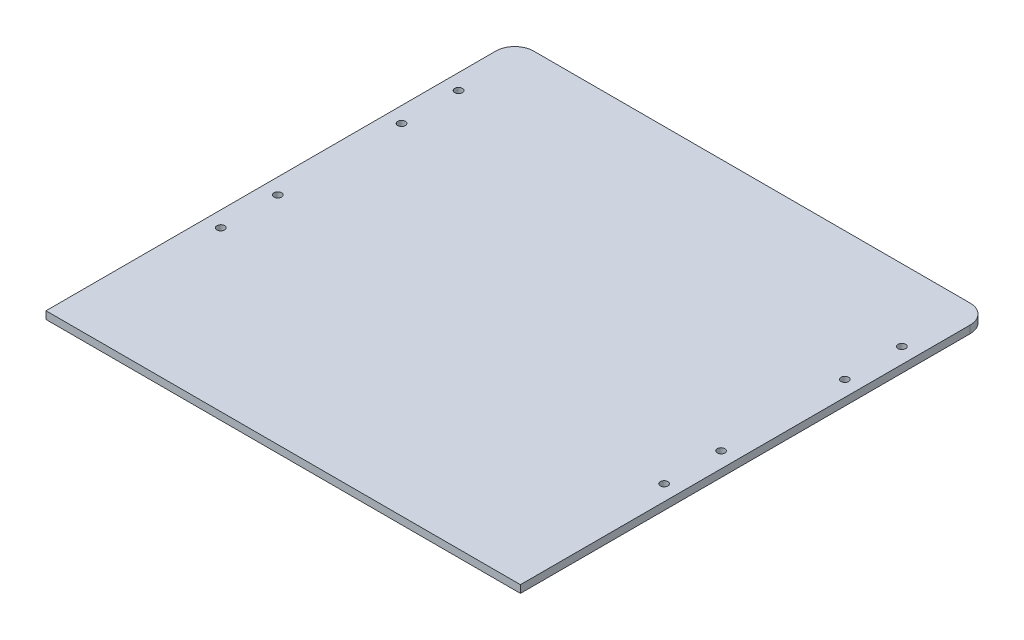
ISO-10303-21;
HEADER;
FILE_DESCRIPTION(('STEP AP214'),'2;1');
FILE_NAME('part.step','',(''),(''),'','','');
FILE_SCHEMA(('AUTOMOTIVE_DESIGN { 1 0 10303 214 1 1 1 1 }'));
ENDSEC;
DATA;
#1=APPLICATION_CONTEXT('core data for automotive mechanical design processes');
#2=APPLICATION_PROTOCOL_DEFINITION('international standard','automotive_design',2000,#1);
#3=PRODUCT_CONTEXT('',#1,'mechanical');
#4=PRODUCT('Part','Part','',(#3));
#5=PRODUCT_RELATED_PRODUCT_CATEGORY('part','',(#4));
#6=PRODUCT_DEFINITION_FORMATION('','',#4);
#7=PRODUCT_DEFINITION_CONTEXT('part definition',#1,'design');
#8=PRODUCT_DEFINITION('design','',#6,#7);
#9=PRODUCT_DEFINITION_SHAPE('','',#8);
#10=(LENGTH_UNIT() NAMED_UNIT(*) SI_UNIT(.MILLI.,.METRE.));
#11=(NAMED_UNIT(*) PLANE_ANGLE_UNIT() SI_UNIT($,.RADIAN.));
#12=(NAMED_UNIT(*) SI_UNIT($,.STERADIAN.) SOLID_ANGLE_UNIT());
#13=UNCERTAINTY_MEASURE_WITH_UNIT(LENGTH_MEASURE(1.E-05),#10,'distance_accuracy_value','');
#14=(GEOMETRIC_REPRESENTATION_CONTEXT(3) GLOBAL_UNCERTAINTY_ASSIGNED_CONTEXT((#13)) GLOBAL_UNIT_ASSIGNED_CONTEXT((#10,
#11,#12)) REPRESENTATION_CONTEXT('',''));
#15=CARTESIAN_POINT('',(0.,0.,0.));
#16=DIRECTION('',(0.,0.,1.));
#17=DIRECTION('',(1.,0.,0.));
#18=AXIS2_PLACEMENT_3D('',#15,#16,#17);
#19=CARTESIAN_POINT('',(-125.,2.,123.5));
#20=DIRECTION('',(1.,0.,0.));
#21=DIRECTION('',(0.,0.,-1.));
#22=AXIS2_PLACEMENT_3D('',#19,#20,#21);
#23=PLANE('',#22);
#24=DIRECTION('',(0.,0.,1.));
#25=VECTOR('',#24,1.);
#26=CARTESIAN_POINT('',(-125.,-2.,123.5));
#27=LINE('',#26,#25);
#28=CARTESIAN_POINT('',(-125.,-2.,-113.5));
#29=VERTEX_POINT('',#28);
#30=CARTESIAN_POINT('',(-125.,-2.,123.5));
#31=VERTEX_POINT('',#30);
#32=EDGE_CURVE('E129',#29,#31,#27,.T.);
#33=ORIENTED_EDGE('',*,*,#32,.T.);
#34=DIRECTION('',(0.,-1.,0.));
#35=VECTOR('',#34,1.);
#36=CARTESIAN_POINT('',(-125.,2.,123.5));
#37=LINE('',#36,#35);
#38=CARTESIAN_POINT('',(-125.,2.,123.5));
#39=VERTEX_POINT('',#38);
#40=EDGE_CURVE('E11',#39,#31,#37,.T.);
#41=ORIENTED_EDGE('',*,*,#40,.F.);
#42=DIRECTION('',(0.,0.,1.));
#43=VECTOR('',#42,1.);
#44=CARTESIAN_POINT('',(-125.,2.,123.5));
#45=LINE('',#44,#43);
#46=CARTESIAN_POINT('',(-125.,2.,-113.5));
#47=VERTEX_POINT('',#46);
#48=EDGE_CURVE('E139',#47,#39,#45,.T.);
#49=ORIENTED_EDGE('',*,*,#48,.F.);
#50=DIRECTION('',(0.,-1.,0.));
#51=VECTOR('',#50,1.);
#52=CARTESIAN_POINT('',(-125.,2.,-113.5));
#53=LINE('',#52,#51);
#54=EDGE_CURVE('E125',#47,#29,#53,.T.);
#55=ORIENTED_EDGE('',*,*,#54,.T.);
#56=EDGE_LOOP('',(#33,#41,#49,#55));
#57=FACE_BOUND('',#56,.T.);
#58=ADVANCED_FACE('F43',(#57),#23,.F.);
#59=CARTESIAN_POINT('',(-125.,2.,123.5));
#60=DIRECTION('',(0.,0.,-1.));
#61=DIRECTION('',(-1.,0.,0.));
#62=AXIS2_PLACEMENT_3D('',#59,#60,#61);
#63=PLANE('',#62);
#64=DIRECTION('',(1.,0.,0.));
#65=VECTOR('',#64,1.);
#66=CARTESIAN_POINT('',(-125.,-2.,123.5));
#67=LINE('',#66,#65);
#68=CARTESIAN_POINT('',(125.,-2.,123.5));
#69=VERTEX_POINT('',#68);
#70=EDGE_CURVE('E132',#31,#69,#67,.T.);
#71=ORIENTED_EDGE('',*,*,#70,.T.);
#72=DIRECTION('',(0.,-1.,0.));
#73=VECTOR('',#72,1.);
#74=CARTESIAN_POINT('',(125.,2.,123.5));
#75=LINE('',#74,#73);
#76=CARTESIAN_POINT('',(125.,2.,123.5));
#77=VERTEX_POINT('',#76);
#78=EDGE_CURVE('E52',#77,#69,#75,.T.);
#79=ORIENTED_EDGE('',*,*,#78,.F.);
#80=DIRECTION('',(1.,0.,0.));
#81=VECTOR('',#80,1.);
#82=CARTESIAN_POINT('',(-125.,2.,123.5));
#83=LINE('',#82,#81);
#84=EDGE_CURVE('E98',#39,#77,#83,.T.);
#85=ORIENTED_EDGE('',*,*,#84,.F.);
#86=ORIENTED_EDGE('',*,*,#40,.T.);
#87=EDGE_LOOP('',(#71,#79,#85,#86));
#88=FACE_BOUND('',#87,.T.);
#89=ADVANCED_FACE('F207',(#88),#63,.F.);
#90=CARTESIAN_POINT('',(125.,2.,123.5));
#91=DIRECTION('',(-1.,0.,0.));
#92=DIRECTION('',(0.,0.,1.));
#93=AXIS2_PLACEMENT_3D('',#90,#91,#92);
#94=PLANE('',#93);
#95=DIRECTION('',(0.,0.,-1.));
#96=VECTOR('',#95,1.);
#97=CARTESIAN_POINT('',(125.,-2.,123.5));
#98=LINE('',#97,#96);
#99=CARTESIAN_POINT('',(125.,-2.,-113.5));
#100=VERTEX_POINT('',#99);
#101=EDGE_CURVE('E134',#69,#100,#98,.T.);
#102=ORIENTED_EDGE('',*,*,#101,.T.);
#103=DIRECTION('',(0.,-1.,0.));
#104=VECTOR('',#103,1.);
#105=CARTESIAN_POINT('',(125.,2.,-113.5));
#106=LINE('',#105,#104);
#107=CARTESIAN_POINT('',(125.,2.,-113.5));
#108=VERTEX_POINT('',#107);
#109=EDGE_CURVE('E120',#108,#100,#106,.T.);
#110=ORIENTED_EDGE('',*,*,#109,.F.);
#111=DIRECTION('',(0.,0.,-1.));
#112=VECTOR('',#111,1.);
#113=CARTESIAN_POINT('',(125.,2.,123.5));
#114=LINE('',#113,#112);
#115=EDGE_CURVE('E111',#77,#108,#114,.T.);
#116=ORIENTED_EDGE('',*,*,#115,.F.);
#117=ORIENTED_EDGE('',*,*,#78,.T.);
#118=EDGE_LOOP('',(#102,#110,#116,#117));
#119=FACE_BOUND('',#118,.T.);
#120=ADVANCED_FACE('F211',(#119),#94,.F.);
#121=CARTESIAN_POINT('',(115.,2.,-113.5));
#122=DIRECTION('',(0.,-1.,0.));
#123=DIRECTION('',(0.,0.,-1.));
#124=AXIS2_PLACEMENT_3D('',#121,#122,#123);
#125=CYLINDRICAL_SURFACE('',#124,9.99999999999999);
#126=CARTESIAN_POINT('',(115.,-2.,-113.5));
#127=DIRECTION('',(0.,1.,0.));
#128=DIRECTION('',(0.,0.,-1.));
#129=AXIS2_PLACEMENT_3D('',#126,#127,#128);
#130=CIRCLE('',#129,9.99999999999999);
#131=CARTESIAN_POINT('',(115.,-2.,-123.5));
#132=VERTEX_POINT('',#131);
#133=EDGE_CURVE('E119',#100,#132,#130,.T.);
#134=ORIENTED_EDGE('',*,*,#133,.T.);
#135=DIRECTION('',(0.,-1.,0.));
#136=VECTOR('',#135,1.);
#137=CARTESIAN_POINT('',(115.,2.,-123.5));
#138=LINE('',#137,#136);
#139=CARTESIAN_POINT('',(115.,2.,-123.5));
#140=VERTEX_POINT('',#139);
#141=EDGE_CURVE('E116',#140,#132,#138,.T.);
#142=ORIENTED_EDGE('',*,*,#141,.F.);
#143=CARTESIAN_POINT('',(115.,2.,-113.5));
#144=DIRECTION('',(0.,1.,0.));
#145=DIRECTION('',(0.,0.,-1.));
#146=AXIS2_PLACEMENT_3D('',#143,#144,#145);
#147=CIRCLE('',#146,9.99999999999999);
#148=EDGE_CURVE('E105',#108,#140,#147,.T.);
#149=ORIENTED_EDGE('',*,*,#148,.F.);
#150=ORIENTED_EDGE('',*,*,#109,.T.);
#151=EDGE_LOOP('',(#134,#142,#149,#150));
#152=FACE_BOUND('',#151,.T.);
#153=ADVANCED_FACE('F117',(#152),#125,.T.);
#154=CARTESIAN_POINT('',(-115.,2.,-123.5));
#155=DIRECTION('',(0.,0.,1.));
#156=DIRECTION('',(1.,0.,0.));
#157=AXIS2_PLACEMENT_3D('',#154,#155,#156);
#158=PLANE('',#157);
#159=DIRECTION('',(-1.,0.,0.));
#160=VECTOR('',#159,1.);
#161=CARTESIAN_POINT('',(-115.,-2.,-123.5));
#162=LINE('',#161,#160);
#163=CARTESIAN_POINT('',(-115.,-2.,-123.5));
#164=VERTEX_POINT('',#163);
#165=EDGE_CURVE('E84',#132,#164,#162,.T.);
#166=ORIENTED_EDGE('',*,*,#165,.T.);
#167=DIRECTION('',(0.,-1.,0.));
#168=VECTOR('',#167,1.);
#169=CARTESIAN_POINT('',(-115.,2.,-123.5));
#170=LINE('',#169,#168);
#171=CARTESIAN_POINT('',(-115.,2.,-123.5));
#172=VERTEX_POINT('',#171);
#173=EDGE_CURVE('E121',#172,#164,#170,.T.);
#174=ORIENTED_EDGE('',*,*,#173,.F.);
#175=DIRECTION('',(-1.,0.,0.));
#176=VECTOR('',#175,1.);
#177=CARTESIAN_POINT('',(-115.,2.,-123.5));
#178=LINE('',#177,#176);
#179=EDGE_CURVE('E109',#140,#172,#178,.T.);
#180=ORIENTED_EDGE('',*,*,#179,.F.);
#181=ORIENTED_EDGE('',*,*,#141,.T.);
#182=EDGE_LOOP('',(#166,#174,#180,#181));
#183=FACE_BOUND('',#182,.T.);
#184=ADVANCED_FACE('F123',(#183),#158,.F.);
#185=CARTESIAN_POINT('',(-115.,2.,-113.5));
#186=DIRECTION('',(0.,-1.,0.));
#187=DIRECTION('',(0.,0.,-1.));
#188=AXIS2_PLACEMENT_3D('',#185,#186,#187);
#189=CYLINDRICAL_SURFACE('',#188,9.99999999999999);
#190=CARTESIAN_POINT('',(-115.,-2.,-113.5));
#191=DIRECTION('',(0.,1.,0.));
#192=DIRECTION('',(0.,0.,-1.));
#193=AXIS2_PLACEMENT_3D('',#190,#191,#192);
#194=CIRCLE('',#193,9.99999999999999);
#195=EDGE_CURVE('E90',#164,#29,#194,.T.);
#196=ORIENTED_EDGE('',*,*,#195,.T.);
#197=ORIENTED_EDGE('',*,*,#54,.F.);
#198=CARTESIAN_POINT('',(-115.,2.,-113.5));
#199=DIRECTION('',(0.,1.,0.));
#200=DIRECTION('',(0.,0.,-1.));
#201=AXIS2_PLACEMENT_3D('',#198,#199,#200);
#202=CIRCLE('',#201,9.99999999999999);
#203=EDGE_CURVE('E61',#172,#47,#202,.T.);
#204=ORIENTED_EDGE('',*,*,#203,.F.);
#205=ORIENTED_EDGE('',*,*,#173,.T.);
#206=EDGE_LOOP('',(#196,#197,#204,#205));
#207=FACE_BOUND('',#206,.T.);
#208=ADVANCED_FACE('F196',(#207),#189,.T.);
#209=CARTESIAN_POINT('',(-115.,2.,-113.5));
#210=DIRECTION('',(0.,-1.,0.));
#211=DIRECTION('',(0.,0.,-1.));
#212=AXIS2_PLACEMENT_3D('',#209,#210,#211);
#213=PLANE('',#212);
#214=CARTESIAN_POINT('',(-116.8,2.,-55.65));
#215=DIRECTION('',(0.,1.,0.));
#216=DIRECTION('',(0.,0.,1.));
#217=AXIS2_PLACEMENT_3D('',#214,#215,#216);
#218=CIRCLE('',#217,2.);
#219=CARTESIAN_POINT('',(-116.8,2.,-53.65));
#220=VERTEX_POINT('',#219);
#221=EDGE_CURVE('E329',#220,#220,#218,.T.);
#222=ORIENTED_EDGE('',*,*,#221,.F.);
#223=EDGE_LOOP('',(#222));
#224=FACE_BOUND('',#223,.T.);
#225=CARTESIAN_POINT('',(-116.8,2.,9.5541600217268));
#226=DIRECTION('',(0.,1.,0.));
#227=DIRECTION('',(0.,0.,1.));
#228=AXIS2_PLACEMENT_3D('',#225,#226,#227);
#229=CIRCLE('',#228,2.);
#230=CARTESIAN_POINT('',(-116.8,2.,11.5541600217268));
#231=VERTEX_POINT('',#230);
#232=EDGE_CURVE('E327',#231,#231,#229,.T.);
#233=ORIENTED_EDGE('',*,*,#232,.F.);
#234=EDGE_LOOP('',(#233));
#235=FACE_BOUND('',#234,.T.);
#236=CARTESIAN_POINT('',(-116.8,2.,39.6));
#237=DIRECTION('',(0.,1.,0.));
#238=DIRECTION('',(0.,0.,1.));
#239=AXIS2_PLACEMENT_3D('',#236,#237,#238);
#240=CIRCLE('',#239,2.);
#241=CARTESIAN_POINT('',(-116.8,2.,41.6));
#242=VERTEX_POINT('',#241);
#243=EDGE_CURVE('E330',#242,#242,#240,.T.);
#244=ORIENTED_EDGE('',*,*,#243,.F.);
#245=EDGE_LOOP('',(#244));
#246=FACE_BOUND('',#245,.T.);
#247=CARTESIAN_POINT('',(116.8,2.,39.6));
#248=DIRECTION('',(0.,1.,0.));
#249=DIRECTION('',(0.,0.,-1.));
#250=AXIS2_PLACEMENT_3D('',#247,#248,#249);
#251=CIRCLE('',#250,2.);
#252=CARTESIAN_POINT('',(116.8,2.,37.6));
#253=VERTEX_POINT('',#252);
#254=EDGE_CURVE('E335',#253,#253,#251,.T.);
#255=ORIENTED_EDGE('',*,*,#254,.F.);
#256=EDGE_LOOP('',(#255));
#257=FACE_BOUND('',#256,.T.);
#258=CARTESIAN_POINT('',(116.8,2.,9.55416002172677));
#259=DIRECTION('',(0.,1.,0.));
#260=DIRECTION('',(0.,0.,-1.));
#261=AXIS2_PLACEMENT_3D('',#258,#259,#260);
#262=CIRCLE('',#261,2.);
#263=CARTESIAN_POINT('',(116.8,2.,7.55416002172677));
#264=VERTEX_POINT('',#263);
#265=EDGE_CURVE('E341',#264,#264,#262,.T.);
#266=ORIENTED_EDGE('',*,*,#265,.F.);
#267=EDGE_LOOP('',(#266));
#268=FACE_BOUND('',#267,.T.);
#269=CARTESIAN_POINT('',(116.8,2.,-55.65));
#270=DIRECTION('',(0.,1.,0.));
#271=DIRECTION('',(0.,0.,-1.));
#272=AXIS2_PLACEMENT_3D('',#269,#270,#271);
#273=CIRCLE('',#272,2.);
#274=CARTESIAN_POINT('',(116.8,2.,-57.65));
#275=VERTEX_POINT('',#274);
#276=EDGE_CURVE('E351',#275,#275,#273,.T.);
#277=ORIENTED_EDGE('',*,*,#276,.F.);
#278=EDGE_LOOP('',(#277));
#279=FACE_BOUND('',#278,.T.);
#280=CARTESIAN_POINT('',(116.8,2.,-85.7));
#281=DIRECTION('',(0.,1.,0.));
#282=DIRECTION('',(0.,0.,-1.));
#283=AXIS2_PLACEMENT_3D('',#280,#281,#282);
#284=CIRCLE('',#283,2.);
#285=CARTESIAN_POINT('',(116.8,2.,-87.7));
#286=VERTEX_POINT('',#285);
#287=EDGE_CURVE('E356',#286,#286,#284,.T.);
#288=ORIENTED_EDGE('',*,*,#287,.F.);
#289=EDGE_LOOP('',(#288));
#290=FACE_BOUND('',#289,.T.);
#291=CARTESIAN_POINT('',(-116.8,2.,-85.7));
#292=DIRECTION('',(0.,1.,0.));
#293=DIRECTION('',(0.,0.,1.));
#294=AXIS2_PLACEMENT_3D('',#291,#292,#293);
#295=CIRCLE('',#294,2.);
#296=CARTESIAN_POINT('',(-116.8,2.,-83.7));
#297=VERTEX_POINT('',#296);
#298=EDGE_CURVE('E149',#297,#297,#295,.T.);
#299=ORIENTED_EDGE('',*,*,#298,.F.);
#300=EDGE_LOOP('',(#299));
#301=FACE_BOUND('',#300,.T.);
#302=ORIENTED_EDGE('',*,*,#48,.T.);
#303=ORIENTED_EDGE('',*,*,#84,.T.);
#304=ORIENTED_EDGE('',*,*,#115,.T.);
#305=ORIENTED_EDGE('',*,*,#148,.T.);
#306=ORIENTED_EDGE('',*,*,#179,.T.);
#307=ORIENTED_EDGE('',*,*,#203,.T.);
#308=EDGE_LOOP('',(#302,#303,#304,#305,#306,#307));
#309=FACE_BOUND('',#308,.T.);
#310=ADVANCED_FACE('F107',(#224,#235,#246,#257,#268,#279,#290,#301,#309),#213,.F.);
#311=CARTESIAN_POINT('',(-115.,-2.,-113.5));
#312=DIRECTION('',(0.,-1.,0.));
#313=DIRECTION('',(0.,0.,-1.));
#314=AXIS2_PLACEMENT_3D('',#311,#312,#313);
#315=PLANE('',#314);
#316=CARTESIAN_POINT('',(-116.8,-2.,-55.65));
#317=DIRECTION('',(0.,-1.,0.));
#318=DIRECTION('',(0.,0.,-1.));
#319=AXIS2_PLACEMENT_3D('',#316,#317,#318);
#320=CIRCLE('',#319,2.);
#321=CARTESIAN_POINT('',(-116.8,-2.,-57.65));
#322=VERTEX_POINT('',#321);
#323=EDGE_CURVE('E46',#322,#322,#320,.T.);
#324=ORIENTED_EDGE('',*,*,#323,.F.);
#325=EDGE_LOOP('',(#324));
#326=FACE_BOUND('',#325,.T.);
#327=CARTESIAN_POINT('',(-116.8,-2.,9.5541600217268));
#328=DIRECTION('',(0.,-1.,0.));
#329=DIRECTION('',(0.,0.,-1.));
#330=AXIS2_PLACEMENT_3D('',#327,#328,#329);
#331=CIRCLE('',#330,2.);
#332=CARTESIAN_POINT('',(-116.8,-2.,7.5541600217268));
#333=VERTEX_POINT('',#332);
#334=EDGE_CURVE('E163',#333,#333,#331,.T.);
#335=ORIENTED_EDGE('',*,*,#334,.F.);
#336=EDGE_LOOP('',(#335));
#337=FACE_BOUND('',#336,.T.);
#338=CARTESIAN_POINT('',(-116.8,-2.,39.6));
#339=DIRECTION('',(0.,-1.,0.));
#340=DIRECTION('',(0.,0.,-1.));
#341=AXIS2_PLACEMENT_3D('',#338,#339,#340);
#342=CIRCLE('',#341,2.);
#343=CARTESIAN_POINT('',(-116.8,-2.,37.6));
#344=VERTEX_POINT('',#343);
#345=EDGE_CURVE('E161',#344,#344,#342,.T.);
#346=ORIENTED_EDGE('',*,*,#345,.F.);
#347=EDGE_LOOP('',(#346));
#348=FACE_BOUND('',#347,.T.);
#349=CARTESIAN_POINT('',(116.8,-2.,39.6));
#350=DIRECTION('',(0.,-1.,0.));
#351=DIRECTION('',(0.,0.,-1.));
#352=AXIS2_PLACEMENT_3D('',#349,#350,#351);
#353=CIRCLE('',#352,2.);
#354=CARTESIAN_POINT('',(116.8,-2.,37.6));
#355=VERTEX_POINT('',#354);
#356=EDGE_CURVE('E158',#355,#355,#353,.T.);
#357=ORIENTED_EDGE('',*,*,#356,.F.);
#358=EDGE_LOOP('',(#357));
#359=FACE_BOUND('',#358,.T.);
#360=CARTESIAN_POINT('',(116.8,-2.,9.55416002172677));
#361=DIRECTION('',(0.,-1.,0.));
#362=DIRECTION('',(0.,0.,-1.));
#363=AXIS2_PLACEMENT_3D('',#360,#361,#362);
#364=CIRCLE('',#363,2.);
#365=CARTESIAN_POINT('',(116.8,-2.,7.55416002172677));
#366=VERTEX_POINT('',#365);
#367=EDGE_CURVE('E155',#366,#366,#364,.T.);
#368=ORIENTED_EDGE('',*,*,#367,.F.);
#369=EDGE_LOOP('',(#368));
#370=FACE_BOUND('',#369,.T.);
#371=CARTESIAN_POINT('',(116.8,-2.,-55.65));
#372=DIRECTION('',(0.,-1.,0.));
#373=DIRECTION('',(0.,0.,-1.));
#374=AXIS2_PLACEMENT_3D('',#371,#372,#373);
#375=CIRCLE('',#374,2.);
#376=CARTESIAN_POINT('',(116.8,-2.,-57.65));
#377=VERTEX_POINT('',#376);
#378=EDGE_CURVE('E152',#377,#377,#375,.T.);
#379=ORIENTED_EDGE('',*,*,#378,.F.);
#380=EDGE_LOOP('',(#379));
#381=FACE_BOUND('',#380,.T.);
#382=CARTESIAN_POINT('',(116.8,-2.,-85.7));
#383=DIRECTION('',(0.,-1.,0.));
#384=DIRECTION('',(0.,0.,-1.));
#385=AXIS2_PLACEMENT_3D('',#382,#383,#384);
#386=CIRCLE('',#385,2.);
#387=CARTESIAN_POINT('',(116.8,-2.,-87.7));
#388=VERTEX_POINT('',#387);
#389=EDGE_CURVE('E148',#388,#388,#386,.T.);
#390=ORIENTED_EDGE('',*,*,#389,.F.);
#391=EDGE_LOOP('',(#390));
#392=FACE_BOUND('',#391,.T.);
#393=CARTESIAN_POINT('',(-116.8,-2.,-85.7));
#394=DIRECTION('',(0.,-1.,0.));
#395=DIRECTION('',(0.,0.,-1.));
#396=AXIS2_PLACEMENT_3D('',#393,#394,#395);
#397=CIRCLE('',#396,2.);
#398=CARTESIAN_POINT('',(-116.8,-2.,-87.7));
#399=VERTEX_POINT('',#398);
#400=EDGE_CURVE('E145',#399,#399,#397,.T.);
#401=ORIENTED_EDGE('',*,*,#400,.F.);
#402=EDGE_LOOP('',(#401));
#403=FACE_BOUND('',#402,.T.);
#404=ORIENTED_EDGE('',*,*,#32,.F.);
#405=ORIENTED_EDGE('',*,*,#195,.F.);
#406=ORIENTED_EDGE('',*,*,#165,.F.);
#407=ORIENTED_EDGE('',*,*,#133,.F.);
#408=ORIENTED_EDGE('',*,*,#101,.F.);
#409=ORIENTED_EDGE('',*,*,#70,.F.);
#410=EDGE_LOOP('',(#404,#405,#406,#407,#408,#409));
#411=FACE_BOUND('',#410,.T.);
#412=ADVANCED_FACE('F173',(#326,#337,#348,#359,#370,#381,#392,#403,#411),#315,.T.);
#413=CARTESIAN_POINT('',(-116.8,-8.,-85.7));
#414=DIRECTION('',(0.,1.,0.));
#415=DIRECTION('',(0.,0.,1.));
#416=AXIS2_PLACEMENT_3D('',#413,#414,#415);
#417=CYLINDRICAL_SURFACE('',#416,2.);
#418=ORIENTED_EDGE('',*,*,#400,.T.);
#419=EDGE_LOOP('',(#418));
#420=FACE_BOUND('',#419,.T.);
#421=ORIENTED_EDGE('',*,*,#298,.T.);
#422=EDGE_LOOP('',(#421));
#423=FACE_BOUND('',#422,.T.);
#424=ADVANCED_FACE('F176',(#420,#423),#417,.F.);
#425=CARTESIAN_POINT('',(116.8,-8.,-85.7));
#426=DIRECTION('',(0.,1.,0.));
#427=DIRECTION('',(0.,0.,1.));
#428=AXIS2_PLACEMENT_3D('',#425,#426,#427);
#429=CYLINDRICAL_SURFACE('',#428,2.);
#430=ORIENTED_EDGE('',*,*,#389,.T.);
#431=EDGE_LOOP('',(#430));
#432=FACE_BOUND('',#431,.T.);
#433=ORIENTED_EDGE('',*,*,#287,.T.);
#434=EDGE_LOOP('',(#433));
#435=FACE_BOUND('',#434,.T.);
#436=ADVANCED_FACE('F254',(#432,#435),#429,.F.);
#437=CARTESIAN_POINT('',(116.8,-8.,-55.65));
#438=DIRECTION('',(0.,1.,0.));
#439=DIRECTION('',(0.,0.,1.));
#440=AXIS2_PLACEMENT_3D('',#437,#438,#439);
#441=CYLINDRICAL_SURFACE('',#440,2.);
#442=ORIENTED_EDGE('',*,*,#378,.T.);
#443=EDGE_LOOP('',(#442));
#444=FACE_BOUND('',#443,.T.);
#445=ORIENTED_EDGE('',*,*,#276,.T.);
#446=EDGE_LOOP('',(#445));
#447=FACE_BOUND('',#446,.T.);
#448=ADVANCED_FACE('F264',(#444,#447),#441,.F.);
#449=CARTESIAN_POINT('',(116.8,-8.,9.55416002172677));
#450=DIRECTION('',(0.,1.,0.));
#451=DIRECTION('',(0.,0.,1.));
#452=AXIS2_PLACEMENT_3D('',#449,#450,#451);
#453=CYLINDRICAL_SURFACE('',#452,2.);
#454=ORIENTED_EDGE('',*,*,#367,.T.);
#455=EDGE_LOOP('',(#454));
#456=FACE_BOUND('',#455,.T.);
#457=ORIENTED_EDGE('',*,*,#265,.T.);
#458=EDGE_LOOP('',(#457));
#459=FACE_BOUND('',#458,.T.);
#460=ADVANCED_FACE('F274',(#456,#459),#453,.F.);
#461=CARTESIAN_POINT('',(116.8,-8.,39.6));
#462=DIRECTION('',(0.,1.,0.));
#463=DIRECTION('',(0.,0.,1.));
#464=AXIS2_PLACEMENT_3D('',#461,#462,#463);
#465=CYLINDRICAL_SURFACE('',#464,2.);
#466=ORIENTED_EDGE('',*,*,#356,.T.);
#467=EDGE_LOOP('',(#466));
#468=FACE_BOUND('',#467,.T.);
#469=ORIENTED_EDGE('',*,*,#254,.T.);
#470=EDGE_LOOP('',(#469));
#471=FACE_BOUND('',#470,.T.);
#472=ADVANCED_FACE('F284',(#468,#471),#465,.F.);
#473=CARTESIAN_POINT('',(-116.8,-8.,39.6));
#474=DIRECTION('',(0.,1.,0.));
#475=DIRECTION('',(0.,0.,1.));
#476=AXIS2_PLACEMENT_3D('',#473,#474,#475);
#477=CYLINDRICAL_SURFACE('',#476,2.);
#478=ORIENTED_EDGE('',*,*,#345,.T.);
#479=EDGE_LOOP('',(#478));
#480=FACE_BOUND('',#479,.T.);
#481=ORIENTED_EDGE('',*,*,#243,.T.);
#482=EDGE_LOOP('',(#481));
#483=FACE_BOUND('',#482,.T.);
#484=ADVANCED_FACE('F294',(#480,#483),#477,.F.);
#485=CARTESIAN_POINT('',(-116.8,-8.,9.5541600217268));
#486=DIRECTION('',(0.,1.,0.));
#487=DIRECTION('',(0.,0.,1.));
#488=AXIS2_PLACEMENT_3D('',#485,#486,#487);
#489=CYLINDRICAL_SURFACE('',#488,2.);
#490=ORIENTED_EDGE('',*,*,#334,.T.);
#491=EDGE_LOOP('',(#490));
#492=FACE_BOUND('',#491,.T.);
#493=ORIENTED_EDGE('',*,*,#232,.T.);
#494=EDGE_LOOP('',(#493));
#495=FACE_BOUND('',#494,.T.);
#496=ADVANCED_FACE('F304',(#492,#495),#489,.F.);
#497=CARTESIAN_POINT('',(-116.8,-8.,-55.65));
#498=DIRECTION('',(0.,1.,0.));
#499=DIRECTION('',(0.,0.,1.));
#500=AXIS2_PLACEMENT_3D('',#497,#498,#499);
#501=CYLINDRICAL_SURFACE('',#500,2.);
#502=ORIENTED_EDGE('',*,*,#323,.T.);
#503=EDGE_LOOP('',(#502));
#504=FACE_BOUND('',#503,.T.);
#505=ORIENTED_EDGE('',*,*,#221,.T.);
#506=EDGE_LOOP('',(#505));
#507=FACE_BOUND('',#506,.T.);
#508=ADVANCED_FACE('F170',(#504,#507),#501,.F.);
#509=CLOSED_SHELL('',(#58,#89,#120,#153,#184,#208,#310,#412,#424,#436,#448,#460,#472,#484,#496,#508));
#510=MANIFOLD_SOLID_BREP('B2',#509);
#511=ADVANCED_BREP_SHAPE_REPRESENTATION('',(#18,#510),#14);
#512=SHAPE_DEFINITION_REPRESENTATION(#9,#511);
ENDSEC;
END-ISO-10303-21;
